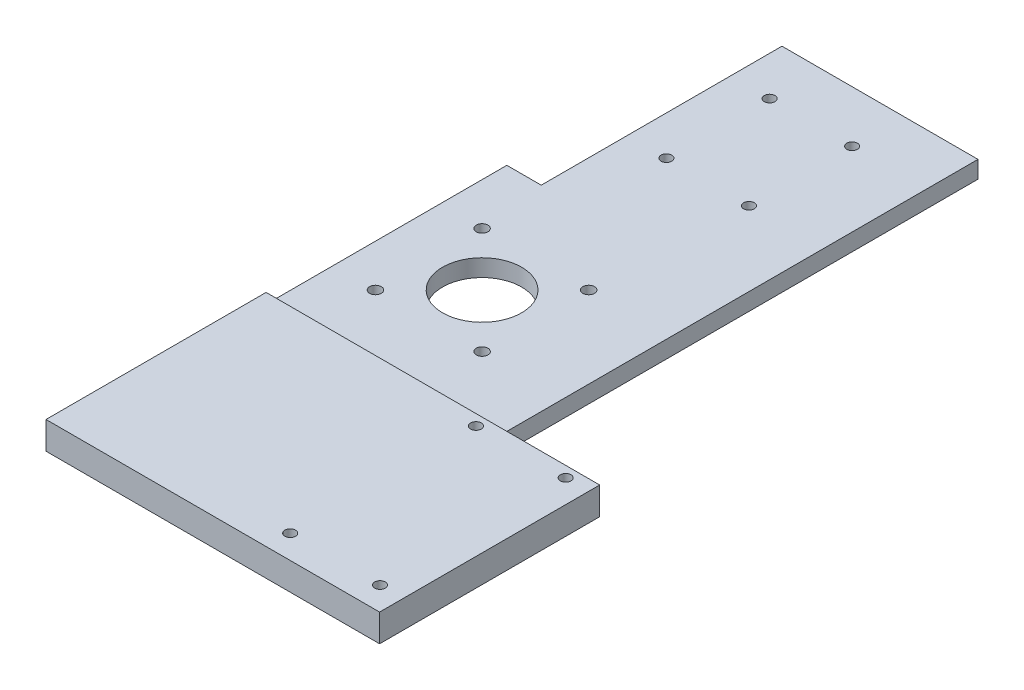
ISO-10303-21;
HEADER;
FILE_DESCRIPTION(('STEP AP214'),'2;1');
FILE_NAME('part.step','',(''),(''),'','','');
FILE_SCHEMA(('AUTOMOTIVE_DESIGN { 1 0 10303 214 1 1 1 1 }'));
ENDSEC;
DATA;
#1=APPLICATION_CONTEXT('core data for automotive mechanical design processes');
#2=APPLICATION_PROTOCOL_DEFINITION('international standard','automotive_design',2000,#1);
#3=PRODUCT_CONTEXT('',#1,'mechanical');
#4=PRODUCT('Part','Part','',(#3));
#5=PRODUCT_RELATED_PRODUCT_CATEGORY('part','',(#4));
#6=PRODUCT_DEFINITION_FORMATION('','',#4);
#7=PRODUCT_DEFINITION_CONTEXT('part definition',#1,'design');
#8=PRODUCT_DEFINITION('design','',#6,#7);
#9=PRODUCT_DEFINITION_SHAPE('','',#8);
#10=(LENGTH_UNIT() NAMED_UNIT(*) SI_UNIT(.MILLI.,.METRE.));
#11=(NAMED_UNIT(*) PLANE_ANGLE_UNIT() SI_UNIT($,.RADIAN.));
#12=(NAMED_UNIT(*) SI_UNIT($,.STERADIAN.) SOLID_ANGLE_UNIT());
#13=UNCERTAINTY_MEASURE_WITH_UNIT(LENGTH_MEASURE(1.E-05),#10,'distance_accuracy_value','');
#14=(GEOMETRIC_REPRESENTATION_CONTEXT(3) GLOBAL_UNCERTAINTY_ASSIGNED_CONTEXT((#13)) GLOBAL_UNIT_ASSIGNED_CONTEXT((#10,
#11,#12)) REPRESENTATION_CONTEXT('',''));
#15=CARTESIAN_POINT('',(0.,0.,0.));
#16=DIRECTION('',(0.,0.,1.));
#17=DIRECTION('',(1.,0.,0.));
#18=AXIS2_PLACEMENT_3D('',#15,#16,#17);
#19=CARTESIAN_POINT('',(0.,5.,0.));
#20=DIRECTION('',(1.,0.,0.));
#21=DIRECTION('',(0.,0.,-1.));
#22=AXIS2_PLACEMENT_3D('',#19,#20,#21);
#23=PLANE('',#22);
#24=DIRECTION('',(0.,-1.,0.));
#25=VECTOR('',#24,1.);
#26=CARTESIAN_POINT('',(0.,5.,70.));
#27=LINE('',#26,#25);
#28=CARTESIAN_POINT('',(0.,5.,70.));
#29=VERTEX_POINT('',#28);
#30=CARTESIAN_POINT('',(0.,0.,70.));
#31=VERTEX_POINT('',#30);
#32=EDGE_CURVE('E53',#29,#31,#27,.T.);
#33=ORIENTED_EDGE('',*,*,#32,.F.);
#34=DIRECTION('',(0.,0.,1.));
#35=VECTOR('',#34,1.);
#36=CARTESIAN_POINT('',(0.,5.,0.));
#37=LINE('',#36,#35);
#38=CARTESIAN_POINT('',(0.,5.,0.));
#39=VERTEX_POINT('',#38);
#40=EDGE_CURVE('E216',#39,#29,#37,.T.);
#41=ORIENTED_EDGE('',*,*,#40,.F.);
#42=DIRECTION('',(0.,-1.,0.));
#43=VECTOR('',#42,1.);
#44=CARTESIAN_POINT('',(0.,5.,0.));
#45=LINE('',#44,#43);
#46=CARTESIAN_POINT('',(0.,0.,0.));
#47=VERTEX_POINT('',#46);
#48=EDGE_CURVE('E223',#39,#47,#45,.T.);
#49=ORIENTED_EDGE('',*,*,#48,.T.);
#50=DIRECTION('',(0.,0.,1.));
#51=VECTOR('',#50,1.);
#52=CARTESIAN_POINT('',(0.,0.,0.));
#53=LINE('',#52,#51);
#54=EDGE_CURVE('E215',#47,#31,#53,.T.);
#55=ORIENTED_EDGE('',*,*,#54,.T.);
#56=EDGE_LOOP('',(#33,#41,#49,#55));
#57=FACE_BOUND('',#56,.T.);
#58=ADVANCED_FACE('F37',(#57),#23,.F.);
#59=CARTESIAN_POINT('',(57.,5.,0.));
#60=DIRECTION('',(-1.,0.,0.));
#61=DIRECTION('',(0.,0.,1.));
#62=AXIS2_PLACEMENT_3D('',#59,#60,#61);
#63=PLANE('',#62);
#64=DIRECTION('',(0.,0.,-1.));
#65=VECTOR('',#64,1.);
#66=CARTESIAN_POINT('',(57.,0.,0.));
#67=LINE('',#66,#65);
#68=CARTESIAN_POINT('',(57.,0.,140.));
#69=VERTEX_POINT('',#68);
#70=CARTESIAN_POINT('',(57.,0.,0.));
#71=VERTEX_POINT('',#70);
#72=EDGE_CURVE('E125',#69,#71,#67,.T.);
#73=ORIENTED_EDGE('',*,*,#72,.T.);
#74=DIRECTION('',(0.,-1.,0.));
#75=VECTOR('',#74,1.);
#76=CARTESIAN_POINT('',(57.,5.,0.));
#77=LINE('',#76,#75);
#78=CARTESIAN_POINT('',(57.,5.,0.));
#79=VERTEX_POINT('',#78);
#80=EDGE_CURVE('E45',#79,#71,#77,.T.);
#81=ORIENTED_EDGE('',*,*,#80,.F.);
#82=DIRECTION('',(0.,0.,-1.));
#83=VECTOR('',#82,1.);
#84=CARTESIAN_POINT('',(57.,5.,0.));
#85=LINE('',#84,#83);
#86=CARTESIAN_POINT('',(57.,5.,140.));
#87=VERTEX_POINT('',#86);
#88=EDGE_CURVE('E220',#87,#79,#85,.T.);
#89=ORIENTED_EDGE('',*,*,#88,.F.);
#90=DIRECTION('',(0.,-1.,0.));
#91=VECTOR('',#90,1.);
#92=CARTESIAN_POINT('',(57.,5.,140.));
#93=LINE('',#92,#91);
#94=EDGE_CURVE('E11',#87,#69,#93,.T.);
#95=ORIENTED_EDGE('',*,*,#94,.T.);
#96=EDGE_LOOP('',(#73,#81,#89,#95));
#97=FACE_BOUND('',#96,.T.);
#98=ADVANCED_FACE('F259',(#97),#63,.F.);
#99=CARTESIAN_POINT('',(0.,5.,0.));
#100=DIRECTION('',(0.,0.,1.));
#101=DIRECTION('',(1.,0.,0.));
#102=AXIS2_PLACEMENT_3D('',#99,#100,#101);
#103=PLANE('',#102);
#104=DIRECTION('',(-1.,0.,0.));
#105=VECTOR('',#104,1.);
#106=CARTESIAN_POINT('',(0.,0.,0.));
#107=LINE('',#106,#105);
#108=EDGE_CURVE('E75',#71,#47,#107,.T.);
#109=ORIENTED_EDGE('',*,*,#108,.T.);
#110=ORIENTED_EDGE('',*,*,#48,.F.);
#111=DIRECTION('',(-1.,0.,0.));
#112=VECTOR('',#111,1.);
#113=CARTESIAN_POINT('',(0.,5.,0.));
#114=LINE('',#113,#112);
#115=EDGE_CURVE('E61',#79,#39,#114,.T.);
#116=ORIENTED_EDGE('',*,*,#115,.F.);
#117=ORIENTED_EDGE('',*,*,#80,.T.);
#118=EDGE_LOOP('',(#109,#110,#116,#117));
#119=FACE_BOUND('',#118,.T.);
#120=ADVANCED_FACE('F263',(#119),#103,.F.);
#121=CARTESIAN_POINT('',(0.,5.,0.));
#122=DIRECTION('',(0.,1.,0.));
#123=DIRECTION('',(0.,0.,1.));
#124=AXIS2_PLACEMENT_3D('',#121,#122,#123);
#125=PLANE('',#124);
#126=CARTESIAN_POINT('',(33.3,5.,120.5));
#127=DIRECTION('',(0.,1.,0.));
#128=DIRECTION('',(0.,0.,1.));
#129=AXIS2_PLACEMENT_3D('',#126,#127,#128);
#130=CIRCLE('',#129,1.7);
#131=CARTESIAN_POINT('',(33.3,5.,122.2));
#132=VERTEX_POINT('',#131);
#133=EDGE_CURVE('E136',#132,#132,#130,.T.);
#134=ORIENTED_EDGE('',*,*,#133,.F.);
#135=EDGE_LOOP('',(#134));
#136=FACE_BOUND('',#135,.T.);
#137=CARTESIAN_POINT('',(2.30000000000002,5.,120.5));
#138=DIRECTION('',(0.,1.,0.));
#139=DIRECTION('',(0.,0.,1.));
#140=AXIS2_PLACEMENT_3D('',#137,#138,#139);
#141=CIRCLE('',#140,1.7);
#142=CARTESIAN_POINT('',(2.30000000000002,5.,122.2));
#143=VERTEX_POINT('',#142);
#144=EDGE_CURVE('E170',#143,#143,#141,.T.);
#145=ORIENTED_EDGE('',*,*,#144,.F.);
#146=EDGE_LOOP('',(#145));
#147=FACE_BOUND('',#146,.T.);
#148=CARTESIAN_POINT('',(2.30000000000002,5.,89.5));
#149=DIRECTION('',(0.,1.,0.));
#150=DIRECTION('',(0.,0.,1.));
#151=AXIS2_PLACEMENT_3D('',#148,#149,#150);
#152=CIRCLE('',#151,1.7);
#153=CARTESIAN_POINT('',(2.30000000000002,5.,91.2));
#154=VERTEX_POINT('',#153);
#155=EDGE_CURVE('E167',#154,#154,#152,.T.);
#156=ORIENTED_EDGE('',*,*,#155,.F.);
#157=EDGE_LOOP('',(#156));
#158=FACE_BOUND('',#157,.T.);
#159=CARTESIAN_POINT('',(33.3,5.,89.5));
#160=DIRECTION('',(0.,1.,0.));
#161=DIRECTION('',(0.,0.,1.));
#162=AXIS2_PLACEMENT_3D('',#159,#160,#161);
#163=CIRCLE('',#162,1.7);
#164=CARTESIAN_POINT('',(33.3,5.,91.2));
#165=VERTEX_POINT('',#164);
#166=EDGE_CURVE('E163',#165,#165,#163,.T.);
#167=ORIENTED_EDGE('',*,*,#166,.F.);
#168=EDGE_LOOP('',(#167));
#169=FACE_BOUND('',#168,.T.);
#170=CARTESIAN_POINT('',(17.8,5.,105.));
#171=DIRECTION('',(0.,1.,0.));
#172=DIRECTION('',(0.,0.,1.));
#173=AXIS2_PLACEMENT_3D('',#170,#171,#172);
#174=CIRCLE('',#173,11.5);
#175=CARTESIAN_POINT('',(17.8,5.,116.5));
#176=VERTEX_POINT('',#175);
#177=EDGE_CURVE('E166',#176,#176,#174,.T.);
#178=ORIENTED_EDGE('',*,*,#177,.F.);
#179=EDGE_LOOP('',(#178));
#180=FACE_BOUND('',#179,.T.);
#181=CARTESIAN_POINT('',(35.3999999999997,5.,45.0000000000148));
#182=DIRECTION('',(0.,1.,0.));
#183=DIRECTION('',(0.,0.,1.));
#184=AXIS2_PLACEMENT_3D('',#181,#182,#183);
#185=CIRCLE('',#184,1.55000000000001);
#186=CARTESIAN_POINT('',(35.3999999999997,5.,46.5500000000148));
#187=VERTEX_POINT('',#186);
#188=EDGE_CURVE('E212',#187,#187,#185,.T.);
#189=ORIENTED_EDGE('',*,*,#188,.F.);
#190=EDGE_LOOP('',(#189));
#191=FACE_BOUND('',#190,.T.);
#192=CARTESIAN_POINT('',(35.3999999999997,5.,15.0000000000148));
#193=DIRECTION('',(0.,1.,0.));
#194=DIRECTION('',(0.,0.,1.));
#195=AXIS2_PLACEMENT_3D('',#192,#193,#194);
#196=CIRCLE('',#195,1.54999999999999);
#197=CARTESIAN_POINT('',(35.3999999999997,5.,16.5500000000148));
#198=VERTEX_POINT('',#197);
#199=EDGE_CURVE('E209',#198,#198,#196,.T.);
#200=ORIENTED_EDGE('',*,*,#199,.F.);
#201=EDGE_LOOP('',(#200));
#202=FACE_BOUND('',#201,.T.);
#203=CARTESIAN_POINT('',(11.3999999999997,5.,15.0000000000148));
#204=DIRECTION('',(0.,1.,0.));
#205=DIRECTION('',(0.,0.,1.));
#206=AXIS2_PLACEMENT_3D('',#203,#204,#205);
#207=CIRCLE('',#206,1.55000000000001);
#208=CARTESIAN_POINT('',(11.3999999999997,5.,16.5500000000148));
#209=VERTEX_POINT('',#208);
#210=EDGE_CURVE('E206',#209,#209,#207,.T.);
#211=ORIENTED_EDGE('',*,*,#210,.F.);
#212=EDGE_LOOP('',(#211));
#213=FACE_BOUND('',#212,.T.);
#214=CARTESIAN_POINT('',(11.3999999999997,5.,45.0000000000148));
#215=DIRECTION('',(0.,1.,0.));
#216=DIRECTION('',(0.,0.,1.));
#217=AXIS2_PLACEMENT_3D('',#214,#215,#216);
#218=CIRCLE('',#217,1.55000000000002);
#219=CARTESIAN_POINT('',(11.3999999999997,5.,46.5500000000148));
#220=VERTEX_POINT('',#219);
#221=EDGE_CURVE('E203',#220,#220,#218,.T.);
#222=ORIENTED_EDGE('',*,*,#221,.F.);
#223=EDGE_LOOP('',(#222));
#224=FACE_BOUND('',#223,.T.);
#225=ORIENTED_EDGE('',*,*,#40,.T.);
#226=DIRECTION('',(1.,0.,0.));
#227=VECTOR('',#226,1.);
#228=CARTESIAN_POINT('',(-9.99999999999999,5.,70.));
#229=LINE('',#228,#227);
#230=CARTESIAN_POINT('',(-9.99999999999999,5.,70.));
#231=VERTEX_POINT('',#230);
#232=EDGE_CURVE('E188',#231,#29,#229,.T.);
#233=ORIENTED_EDGE('',*,*,#232,.F.);
#234=DIRECTION('',(0.,0.,-1.));
#235=VECTOR('',#234,1.);
#236=CARTESIAN_POINT('',(-9.99999999999998,5.,140.));
#237=LINE('',#236,#235);
#238=CARTESIAN_POINT('',(-9.99999999999998,5.,140.));
#239=VERTEX_POINT('',#238);
#240=EDGE_CURVE('E178',#239,#231,#237,.T.);
#241=ORIENTED_EDGE('',*,*,#240,.F.);
#242=DIRECTION('',(1.,0.,0.));
#243=VECTOR('',#242,1.);
#244=CARTESIAN_POINT('',(0.,5.,140.));
#245=LINE('',#244,#243);
#246=EDGE_CURVE('E218',#239,#87,#245,.T.);
#247=ORIENTED_EDGE('',*,*,#246,.T.);
#248=ORIENTED_EDGE('',*,*,#88,.T.);
#249=ORIENTED_EDGE('',*,*,#115,.T.);
#250=EDGE_LOOP('',(#225,#233,#241,#247,#248,#249));
#251=FACE_BOUND('',#250,.T.);
#252=ADVANCED_FACE('F268',(#136,#147,#158,#169,#180,#191,#202,#213,#224,#251),#125,.T.);
#253=CARTESIAN_POINT('',(0.,0.,0.));
#254=DIRECTION('',(0.,1.,0.));
#255=DIRECTION('',(0.,0.,1.));
#256=AXIS2_PLACEMENT_3D('',#253,#254,#255);
#257=PLANE('',#256);
#258=CARTESIAN_POINT('',(80.2500000000012,0.,197.137921191533));
#259=DIRECTION('',(0.,1.,0.));
#260=DIRECTION('',(0.,0.,1.));
#261=AXIS2_PLACEMENT_3D('',#258,#259,#260);
#262=CIRCLE('',#261,1.54999999999999);
#263=CARTESIAN_POINT('',(80.2500000000012,0.,198.687921191533));
#264=VERTEX_POINT('',#263);
#265=EDGE_CURVE('E142',#264,#264,#262,.T.);
#266=ORIENTED_EDGE('',*,*,#265,.T.);
#267=EDGE_LOOP('',(#266));
#268=FACE_BOUND('',#267,.T.);
#269=CARTESIAN_POINT('',(54.1500000000012,0.,143.137921191533));
#270=DIRECTION('',(0.,1.,0.));
#271=DIRECTION('',(0.,0.,1.));
#272=AXIS2_PLACEMENT_3D('',#269,#270,#271);
#273=CIRCLE('',#272,1.55);
#274=CARTESIAN_POINT('',(54.1500000000012,0.,144.687921191533));
#275=VERTEX_POINT('',#274);
#276=EDGE_CURVE('E145',#275,#275,#273,.T.);
#277=ORIENTED_EDGE('',*,*,#276,.T.);
#278=EDGE_LOOP('',(#277));
#279=FACE_BOUND('',#278,.T.);
#280=CARTESIAN_POINT('',(80.2500000000012,0.,143.137921191533));
#281=DIRECTION('',(0.,1.,0.));
#282=DIRECTION('',(0.,0.,1.));
#283=AXIS2_PLACEMENT_3D('',#280,#281,#282);
#284=CIRCLE('',#283,1.54999999999999);
#285=CARTESIAN_POINT('',(80.2500000000012,0.,144.687921191533));
#286=VERTEX_POINT('',#285);
#287=EDGE_CURVE('E490',#286,#286,#284,.T.);
#288=ORIENTED_EDGE('',*,*,#287,.T.);
#289=EDGE_LOOP('',(#288));
#290=FACE_BOUND('',#289,.T.);
#291=CARTESIAN_POINT('',(54.1500000000012,0.,197.137921191533));
#292=DIRECTION('',(0.,1.,0.));
#293=DIRECTION('',(0.,0.,1.));
#294=AXIS2_PLACEMENT_3D('',#291,#292,#293);
#295=CIRCLE('',#294,1.55);
#296=CARTESIAN_POINT('',(54.1500000000012,0.,198.687921191533));
#297=VERTEX_POINT('',#296);
#298=EDGE_CURVE('E493',#297,#297,#295,.T.);
#299=ORIENTED_EDGE('',*,*,#298,.T.);
#300=EDGE_LOOP('',(#299));
#301=FACE_BOUND('',#300,.T.);
#302=CARTESIAN_POINT('',(33.3,0.,120.5));
#303=DIRECTION('',(0.,1.,0.));
#304=DIRECTION('',(0.,0.,1.));
#305=AXIS2_PLACEMENT_3D('',#302,#303,#304);
#306=CIRCLE('',#305,1.7);
#307=CARTESIAN_POINT('',(33.3,0.,122.2));
#308=VERTEX_POINT('',#307);
#309=EDGE_CURVE('E40',#308,#308,#306,.T.);
#310=ORIENTED_EDGE('',*,*,#309,.T.);
#311=EDGE_LOOP('',(#310));
#312=FACE_BOUND('',#311,.T.);
#313=CARTESIAN_POINT('',(2.30000000000002,0.,120.5));
#314=DIRECTION('',(0.,1.,0.));
#315=DIRECTION('',(0.,0.,1.));
#316=AXIS2_PLACEMENT_3D('',#313,#314,#315);
#317=CIRCLE('',#316,1.7);
#318=CARTESIAN_POINT('',(2.30000000000002,0.,122.2));
#319=VERTEX_POINT('',#318);
#320=EDGE_CURVE('E236',#319,#319,#317,.T.);
#321=ORIENTED_EDGE('',*,*,#320,.T.);
#322=EDGE_LOOP('',(#321));
#323=FACE_BOUND('',#322,.T.);
#324=CARTESIAN_POINT('',(2.30000000000002,0.,89.5));
#325=DIRECTION('',(0.,1.,0.));
#326=DIRECTION('',(0.,0.,1.));
#327=AXIS2_PLACEMENT_3D('',#324,#325,#326);
#328=CIRCLE('',#327,1.7);
#329=CARTESIAN_POINT('',(2.30000000000002,0.,91.2));
#330=VERTEX_POINT('',#329);
#331=EDGE_CURVE('E234',#330,#330,#328,.T.);
#332=ORIENTED_EDGE('',*,*,#331,.T.);
#333=EDGE_LOOP('',(#332));
#334=FACE_BOUND('',#333,.T.);
#335=CARTESIAN_POINT('',(33.3,0.,89.5));
#336=DIRECTION('',(0.,1.,0.));
#337=DIRECTION('',(0.,0.,1.));
#338=AXIS2_PLACEMENT_3D('',#335,#336,#337);
#339=CIRCLE('',#338,1.7);
#340=CARTESIAN_POINT('',(33.3,0.,91.2));
#341=VERTEX_POINT('',#340);
#342=EDGE_CURVE('E231',#341,#341,#339,.T.);
#343=ORIENTED_EDGE('',*,*,#342,.T.);
#344=EDGE_LOOP('',(#343));
#345=FACE_BOUND('',#344,.T.);
#346=CARTESIAN_POINT('',(17.8,0.,105.));
#347=DIRECTION('',(0.,1.,0.));
#348=DIRECTION('',(0.,0.,1.));
#349=AXIS2_PLACEMENT_3D('',#346,#347,#348);
#350=CIRCLE('',#349,11.5);
#351=CARTESIAN_POINT('',(17.8,0.,116.5));
#352=VERTEX_POINT('',#351);
#353=EDGE_CURVE('E177',#352,#352,#350,.T.);
#354=ORIENTED_EDGE('',*,*,#353,.T.);
#355=EDGE_LOOP('',(#354));
#356=FACE_BOUND('',#355,.T.);
#357=CARTESIAN_POINT('',(35.3999999999997,0.,45.0000000000148));
#358=DIRECTION('',(0.,-1.,0.));
#359=DIRECTION('',(0.,0.,-1.));
#360=AXIS2_PLACEMENT_3D('',#357,#358,#359);
#361=CIRCLE('',#360,1.55000000000001);
#362=CARTESIAN_POINT('',(35.3999999999997,0.,43.4500000000148));
#363=VERTEX_POINT('',#362);
#364=EDGE_CURVE('E191',#363,#363,#361,.T.);
#365=ORIENTED_EDGE('',*,*,#364,.F.);
#366=EDGE_LOOP('',(#365));
#367=FACE_BOUND('',#366,.T.);
#368=CARTESIAN_POINT('',(35.3999999999997,0.,15.0000000000148));
#369=DIRECTION('',(0.,-1.,0.));
#370=DIRECTION('',(0.,0.,-1.));
#371=AXIS2_PLACEMENT_3D('',#368,#369,#370);
#372=CIRCLE('',#371,1.54999999999999);
#373=CARTESIAN_POINT('',(35.3999999999997,0.,13.4500000000148));
#374=VERTEX_POINT('',#373);
#375=EDGE_CURVE('E196',#374,#374,#372,.T.);
#376=ORIENTED_EDGE('',*,*,#375,.F.);
#377=EDGE_LOOP('',(#376));
#378=FACE_BOUND('',#377,.T.);
#379=CARTESIAN_POINT('',(11.3999999999997,0.,15.0000000000148));
#380=DIRECTION('',(0.,-1.,0.));
#381=DIRECTION('',(0.,0.,-1.));
#382=AXIS2_PLACEMENT_3D('',#379,#380,#381);
#383=CIRCLE('',#382,1.55000000000001);
#384=CARTESIAN_POINT('',(11.3999999999997,0.,13.4500000000148));
#385=VERTEX_POINT('',#384);
#386=EDGE_CURVE('E192',#385,#385,#383,.T.);
#387=ORIENTED_EDGE('',*,*,#386,.F.);
#388=EDGE_LOOP('',(#387));
#389=FACE_BOUND('',#388,.T.);
#390=CARTESIAN_POINT('',(11.3999999999997,0.,45.0000000000148));
#391=DIRECTION('',(0.,-1.,0.));
#392=DIRECTION('',(0.,0.,-1.));
#393=AXIS2_PLACEMENT_3D('',#390,#391,#392);
#394=CIRCLE('',#393,1.55000000000002);
#395=CARTESIAN_POINT('',(11.3999999999997,0.,43.4500000000148));
#396=VERTEX_POINT('',#395);
#397=EDGE_CURVE('E195',#396,#396,#394,.T.);
#398=ORIENTED_EDGE('',*,*,#397,.F.);
#399=EDGE_LOOP('',(#398));
#400=FACE_BOUND('',#399,.T.);
#401=ORIENTED_EDGE('',*,*,#54,.F.);
#402=ORIENTED_EDGE('',*,*,#108,.F.);
#403=ORIENTED_EDGE('',*,*,#72,.F.);
#404=DIRECTION('',(1.,0.,0.));
#405=VECTOR('',#404,1.);
#406=CARTESIAN_POINT('',(0.,0.,140.));
#407=LINE('',#406,#405);
#408=CARTESIAN_POINT('',(87.,0.,140.));
#409=VERTEX_POINT('',#408);
#410=EDGE_CURVE('E117',#69,#409,#407,.T.);
#411=ORIENTED_EDGE('',*,*,#410,.T.);
#412=DIRECTION('',(0.,0.,1.));
#413=VECTOR('',#412,1.);
#414=CARTESIAN_POINT('',(87.,0.,0.));
#415=LINE('',#414,#413);
#416=CARTESIAN_POINT('',(87.,0.,204.));
#417=VERTEX_POINT('',#416);
#418=EDGE_CURVE('E123',#409,#417,#415,.T.);
#419=ORIENTED_EDGE('',*,*,#418,.T.);
#420=DIRECTION('',(1.,0.,0.));
#421=VECTOR('',#420,1.);
#422=CARTESIAN_POINT('',(0.,0.,204.));
#423=LINE('',#422,#421);
#424=CARTESIAN_POINT('',(-9.99999999999997,0.,204.));
#425=VERTEX_POINT('',#424);
#426=EDGE_CURVE('E126',#425,#417,#423,.T.);
#427=ORIENTED_EDGE('',*,*,#426,.F.);
#428=DIRECTION('',(0.,0.,1.));
#429=VECTOR('',#428,1.);
#430=CARTESIAN_POINT('',(-9.99999999999999,0.,70.));
#431=LINE('',#430,#429);
#432=CARTESIAN_POINT('',(-9.99999999999999,0.,70.));
#433=VERTEX_POINT('',#432);
#434=EDGE_CURVE('E182',#433,#425,#431,.T.);
#435=ORIENTED_EDGE('',*,*,#434,.F.);
#436=DIRECTION('',(1.,0.,0.));
#437=VECTOR('',#436,1.);
#438=CARTESIAN_POINT('',(-9.99999999999999,0.,70.));
#439=LINE('',#438,#437);
#440=EDGE_CURVE('E184',#433,#31,#439,.T.);
#441=ORIENTED_EDGE('',*,*,#440,.T.);
#442=EDGE_LOOP('',(#401,#402,#403,#411,#419,#427,#435,#441));
#443=FACE_BOUND('',#442,.T.);
#444=ADVANCED_FACE('F120',(#268,#279,#290,#301,#312,#323,#334,#345,#356,#367,#378,#389,#400,
#443),#257,.F.);
#445=CARTESIAN_POINT('',(11.3999999999997,10.,45.0000000000148));
#446=DIRECTION('',(0.,-1.,0.));
#447=DIRECTION('',(0.,0.,-1.));
#448=AXIS2_PLACEMENT_3D('',#445,#446,#447);
#449=CYLINDRICAL_SURFACE('',#448,1.55000000000002);
#450=ORIENTED_EDGE('',*,*,#221,.T.);
#451=EDGE_LOOP('',(#450));
#452=FACE_BOUND('',#451,.T.);
#453=ORIENTED_EDGE('',*,*,#397,.T.);
#454=EDGE_LOOP('',(#453));
#455=FACE_BOUND('',#454,.T.);
#456=ADVANCED_FACE('F273',(#452,#455),#449,.F.);
#457=CARTESIAN_POINT('',(11.3999999999997,10.,15.0000000000148));
#458=DIRECTION('',(0.,-1.,0.));
#459=DIRECTION('',(0.,0.,-1.));
#460=AXIS2_PLACEMENT_3D('',#457,#458,#459);
#461=CYLINDRICAL_SURFACE('',#460,1.55000000000001);
#462=ORIENTED_EDGE('',*,*,#210,.T.);
#463=EDGE_LOOP('',(#462));
#464=FACE_BOUND('',#463,.T.);
#465=ORIENTED_EDGE('',*,*,#386,.T.);
#466=EDGE_LOOP('',(#465));
#467=FACE_BOUND('',#466,.T.);
#468=ADVANCED_FACE('F280',(#464,#467),#461,.F.);
#469=CARTESIAN_POINT('',(35.3999999999997,10.,15.0000000000148));
#470=DIRECTION('',(0.,-1.,0.));
#471=DIRECTION('',(0.,0.,-1.));
#472=AXIS2_PLACEMENT_3D('',#469,#470,#471);
#473=CYLINDRICAL_SURFACE('',#472,1.54999999999999);
#474=ORIENTED_EDGE('',*,*,#199,.T.);
#475=EDGE_LOOP('',(#474));
#476=FACE_BOUND('',#475,.T.);
#477=ORIENTED_EDGE('',*,*,#375,.T.);
#478=EDGE_LOOP('',(#477));
#479=FACE_BOUND('',#478,.T.);
#480=ADVANCED_FACE('F286',(#476,#479),#473,.F.);
#481=CARTESIAN_POINT('',(35.3999999999997,10.,45.0000000000148));
#482=DIRECTION('',(0.,-1.,0.));
#483=DIRECTION('',(0.,0.,-1.));
#484=AXIS2_PLACEMENT_3D('',#481,#482,#483);
#485=CYLINDRICAL_SURFACE('',#484,1.55000000000001);
#486=ORIENTED_EDGE('',*,*,#188,.T.);
#487=EDGE_LOOP('',(#486));
#488=FACE_BOUND('',#487,.T.);
#489=ORIENTED_EDGE('',*,*,#364,.T.);
#490=EDGE_LOOP('',(#489));
#491=FACE_BOUND('',#490,.T.);
#492=ADVANCED_FACE('F282',(#488,#491),#485,.F.);
#493=CARTESIAN_POINT('',(-9.99999999999999,5.,70.));
#494=DIRECTION('',(0.,0.,1.));
#495=DIRECTION('',(1.,0.,0.));
#496=AXIS2_PLACEMENT_3D('',#493,#494,#495);
#497=PLANE('',#496);
#498=ORIENTED_EDGE('',*,*,#32,.T.);
#499=ORIENTED_EDGE('',*,*,#440,.F.);
#500=DIRECTION('',(0.,-1.,0.));
#501=VECTOR('',#500,1.);
#502=CARTESIAN_POINT('',(-9.99999999999999,5.,70.));
#503=LINE('',#502,#501);
#504=EDGE_CURVE('E180',#231,#433,#503,.T.);
#505=ORIENTED_EDGE('',*,*,#504,.F.);
#506=ORIENTED_EDGE('',*,*,#232,.T.);
#507=EDGE_LOOP('',(#498,#499,#505,#506));
#508=FACE_BOUND('',#507,.T.);
#509=ADVANCED_FACE('F285',(#508),#497,.F.);
#510=CARTESIAN_POINT('',(-10.,0.,0.));
#511=DIRECTION('',(-1.,0.,0.));
#512=DIRECTION('',(0.,0.,1.));
#513=AXIS2_PLACEMENT_3D('',#510,#511,#512);
#514=PLANE('',#513);
#515=ORIENTED_EDGE('',*,*,#434,.T.);
#516=DIRECTION('',(0.,-1.,0.));
#517=VECTOR('',#516,1.);
#518=CARTESIAN_POINT('',(-9.99999999999997,8.,204.));
#519=LINE('',#518,#517);
#520=CARTESIAN_POINT('',(-9.99999999999997,8.,204.));
#521=VERTEX_POINT('',#520);
#522=EDGE_CURVE('E158',#521,#425,#519,.T.);
#523=ORIENTED_EDGE('',*,*,#522,.F.);
#524=DIRECTION('',(0.,0.,1.));
#525=VECTOR('',#524,1.);
#526=CARTESIAN_POINT('',(-10.,8.,0.));
#527=LINE('',#526,#525);
#528=CARTESIAN_POINT('',(-9.99999999999998,8.,140.));
#529=VERTEX_POINT('',#528);
#530=EDGE_CURVE('E153',#529,#521,#527,.T.);
#531=ORIENTED_EDGE('',*,*,#530,.F.);
#532=DIRECTION('',(0.,-1.,0.));
#533=VECTOR('',#532,1.);
#534=CARTESIAN_POINT('',(-9.99999999999998,8.,140.));
#535=LINE('',#534,#533);
#536=EDGE_CURVE('E137',#529,#239,#535,.T.);
#537=ORIENTED_EDGE('',*,*,#536,.T.);
#538=ORIENTED_EDGE('',*,*,#240,.T.);
#539=ORIENTED_EDGE('',*,*,#504,.T.);
#540=EDGE_LOOP('',(#515,#523,#531,#537,#538,#539));
#541=FACE_BOUND('',#540,.T.);
#542=ADVANCED_FACE('F296',(#541),#514,.T.);
#543=CARTESIAN_POINT('',(17.8,-5.,105.));
#544=DIRECTION('',(0.,1.,0.));
#545=DIRECTION('',(0.,0.,1.));
#546=AXIS2_PLACEMENT_3D('',#543,#544,#545);
#547=CYLINDRICAL_SURFACE('',#546,11.5);
#548=ORIENTED_EDGE('',*,*,#177,.T.);
#549=EDGE_LOOP('',(#548));
#550=FACE_BOUND('',#549,.T.);
#551=ORIENTED_EDGE('',*,*,#353,.F.);
#552=EDGE_LOOP('',(#551));
#553=FACE_BOUND('',#552,.T.);
#554=ADVANCED_FACE('F299',(#550,#553),#547,.F.);
#555=CARTESIAN_POINT('',(33.3,-5.,89.5));
#556=DIRECTION('',(0.,1.,0.));
#557=DIRECTION('',(0.,0.,1.));
#558=AXIS2_PLACEMENT_3D('',#555,#556,#557);
#559=CYLINDRICAL_SURFACE('',#558,1.7);
#560=ORIENTED_EDGE('',*,*,#166,.T.);
#561=EDGE_LOOP('',(#560));
#562=FACE_BOUND('',#561,.T.);
#563=ORIENTED_EDGE('',*,*,#342,.F.);
#564=EDGE_LOOP('',(#563));
#565=FACE_BOUND('',#564,.T.);
#566=ADVANCED_FACE('F302',(#562,#565),#559,.F.);
#567=CARTESIAN_POINT('',(2.30000000000002,-5.,89.5));
#568=DIRECTION('',(0.,1.,0.));
#569=DIRECTION('',(0.,0.,1.));
#570=AXIS2_PLACEMENT_3D('',#567,#568,#569);
#571=CYLINDRICAL_SURFACE('',#570,1.7);
#572=ORIENTED_EDGE('',*,*,#155,.T.);
#573=EDGE_LOOP('',(#572));
#574=FACE_BOUND('',#573,.T.);
#575=ORIENTED_EDGE('',*,*,#331,.F.);
#576=EDGE_LOOP('',(#575));
#577=FACE_BOUND('',#576,.T.);
#578=ADVANCED_FACE('F254',(#574,#577),#571,.F.);
#579=CARTESIAN_POINT('',(2.30000000000002,-5.,120.5));
#580=DIRECTION('',(0.,1.,0.));
#581=DIRECTION('',(0.,0.,1.));
#582=AXIS2_PLACEMENT_3D('',#579,#580,#581);
#583=CYLINDRICAL_SURFACE('',#582,1.7);
#584=ORIENTED_EDGE('',*,*,#144,.T.);
#585=EDGE_LOOP('',(#584));
#586=FACE_BOUND('',#585,.T.);
#587=ORIENTED_EDGE('',*,*,#320,.F.);
#588=EDGE_LOOP('',(#587));
#589=FACE_BOUND('',#588,.T.);
#590=ADVANCED_FACE('F246',(#586,#589),#583,.F.);
#591=CARTESIAN_POINT('',(33.3,-5.,120.5));
#592=DIRECTION('',(0.,1.,0.));
#593=DIRECTION('',(0.,0.,1.));
#594=AXIS2_PLACEMENT_3D('',#591,#592,#593);
#595=CYLINDRICAL_SURFACE('',#594,1.7);
#596=ORIENTED_EDGE('',*,*,#133,.T.);
#597=EDGE_LOOP('',(#596));
#598=FACE_BOUND('',#597,.T.);
#599=ORIENTED_EDGE('',*,*,#309,.F.);
#600=EDGE_LOOP('',(#599));
#601=FACE_BOUND('',#600,.T.);
#602=ADVANCED_FACE('F244',(#598,#601),#595,.F.);
#603=CARTESIAN_POINT('',(0.,8.,140.));
#604=DIRECTION('',(0.,0.,-1.));
#605=DIRECTION('',(-1.,0.,0.));
#606=AXIS2_PLACEMENT_3D('',#603,#604,#605);
#607=PLANE('',#606);
#608=ORIENTED_EDGE('',*,*,#94,.F.);
#609=ORIENTED_EDGE('',*,*,#246,.F.);
#610=ORIENTED_EDGE('',*,*,#536,.F.);
#611=DIRECTION('',(1.,0.,0.));
#612=VECTOR('',#611,1.);
#613=CARTESIAN_POINT('',(0.,8.,140.));
#614=LINE('',#613,#612);
#615=CARTESIAN_POINT('',(87.,8.,140.));
#616=VERTEX_POINT('',#615);
#617=EDGE_CURVE('E132',#529,#616,#614,.T.);
#618=ORIENTED_EDGE('',*,*,#617,.T.);
#619=DIRECTION('',(0.,-1.,0.));
#620=VECTOR('',#619,1.);
#621=CARTESIAN_POINT('',(87.,8.,140.));
#622=LINE('',#621,#620);
#623=EDGE_CURVE('E129',#616,#409,#622,.T.);
#624=ORIENTED_EDGE('',*,*,#623,.T.);
#625=ORIENTED_EDGE('',*,*,#410,.F.);
#626=EDGE_LOOP('',(#608,#609,#610,#618,#624,#625));
#627=FACE_BOUND('',#626,.T.);
#628=ADVANCED_FACE('F130',(#627),#607,.T.);
#629=CARTESIAN_POINT('',(87.,8.,0.));
#630=DIRECTION('',(1.,0.,0.));
#631=DIRECTION('',(0.,0.,-1.));
#632=AXIS2_PLACEMENT_3D('',#629,#630,#631);
#633=PLANE('',#632);
#634=DIRECTION('',(0.,-1.,0.));
#635=VECTOR('',#634,1.);
#636=CARTESIAN_POINT('',(87.,8.,204.));
#637=LINE('',#636,#635);
#638=CARTESIAN_POINT('',(87.,8.,204.));
#639=VERTEX_POINT('',#638);
#640=EDGE_CURVE('E141',#639,#417,#637,.T.);
#641=ORIENTED_EDGE('',*,*,#640,.T.);
#642=ORIENTED_EDGE('',*,*,#418,.F.);
#643=ORIENTED_EDGE('',*,*,#623,.F.);
#644=DIRECTION('',(0.,0.,1.));
#645=VECTOR('',#644,1.);
#646=CARTESIAN_POINT('',(87.,8.,0.));
#647=LINE('',#646,#645);
#648=EDGE_CURVE('E150',#616,#639,#647,.T.);
#649=ORIENTED_EDGE('',*,*,#648,.T.);
#650=EDGE_LOOP('',(#641,#642,#643,#649));
#651=FACE_BOUND('',#650,.T.);
#652=ADVANCED_FACE('F139',(#651),#633,.T.);
#653=CARTESIAN_POINT('',(0.,8.,204.));
#654=DIRECTION('',(0.,0.,-1.));
#655=DIRECTION('',(-1.,0.,0.));
#656=AXIS2_PLACEMENT_3D('',#653,#654,#655);
#657=PLANE('',#656);
#658=ORIENTED_EDGE('',*,*,#522,.T.);
#659=ORIENTED_EDGE('',*,*,#426,.T.);
#660=ORIENTED_EDGE('',*,*,#640,.F.);
#661=DIRECTION('',(1.,0.,0.));
#662=VECTOR('',#661,1.);
#663=CARTESIAN_POINT('',(0.,8.,204.));
#664=LINE('',#663,#662);
#665=EDGE_CURVE('E155',#521,#639,#664,.T.);
#666=ORIENTED_EDGE('',*,*,#665,.F.);
#667=EDGE_LOOP('',(#658,#659,#660,#666));
#668=FACE_BOUND('',#667,.T.);
#669=ADVANCED_FACE('F344',(#668),#657,.F.);
#670=CARTESIAN_POINT('',(0.,8.,0.));
#671=DIRECTION('',(0.,1.,0.));
#672=DIRECTION('',(0.,0.,1.));
#673=AXIS2_PLACEMENT_3D('',#670,#671,#672);
#674=PLANE('',#673);
#675=CARTESIAN_POINT('',(80.2500000000012,8.,197.137921191533));
#676=DIRECTION('',(0.,-1.,0.));
#677=DIRECTION('',(0.,0.,-1.));
#678=AXIS2_PLACEMENT_3D('',#675,#676,#677);
#679=CIRCLE('',#678,1.54999999999999);
#680=CARTESIAN_POINT('',(80.2500000000012,8.,195.587921191533));
#681=VERTEX_POINT('',#680);
#682=EDGE_CURVE('E481',#681,#681,#679,.T.);
#683=ORIENTED_EDGE('',*,*,#682,.T.);
#684=EDGE_LOOP('',(#683));
#685=FACE_BOUND('',#684,.T.);
#686=CARTESIAN_POINT('',(54.1500000000012,8.,143.137921191533));
#687=DIRECTION('',(0.,-1.,0.));
#688=DIRECTION('',(0.,0.,-1.));
#689=AXIS2_PLACEMENT_3D('',#686,#687,#688);
#690=CIRCLE('',#689,1.55);
#691=CARTESIAN_POINT('',(54.1500000000012,8.,141.587921191533));
#692=VERTEX_POINT('',#691);
#693=EDGE_CURVE('E501',#692,#692,#690,.T.);
#694=ORIENTED_EDGE('',*,*,#693,.T.);
#695=EDGE_LOOP('',(#694));
#696=FACE_BOUND('',#695,.T.);
#697=CARTESIAN_POINT('',(80.2500000000012,8.,143.137921191533));
#698=DIRECTION('',(0.,-1.,0.));
#699=DIRECTION('',(0.,0.,-1.));
#700=AXIS2_PLACEMENT_3D('',#697,#698,#699);
#701=CIRCLE('',#700,1.54999999999999);
#702=CARTESIAN_POINT('',(80.2500000000012,8.,141.587921191533));
#703=VERTEX_POINT('',#702);
#704=EDGE_CURVE('E504',#703,#703,#701,.T.);
#705=ORIENTED_EDGE('',*,*,#704,.T.);
#706=EDGE_LOOP('',(#705));
#707=FACE_BOUND('',#706,.T.);
#708=CARTESIAN_POINT('',(54.1500000000012,8.,197.137921191533));
#709=DIRECTION('',(0.,-1.,0.));
#710=DIRECTION('',(0.,0.,-1.));
#711=AXIS2_PLACEMENT_3D('',#708,#709,#710);
#712=CIRCLE('',#711,1.55);
#713=CARTESIAN_POINT('',(54.1500000000012,8.,195.587921191533));
#714=VERTEX_POINT('',#713);
#715=EDGE_CURVE('E495',#714,#714,#712,.T.);
#716=ORIENTED_EDGE('',*,*,#715,.T.);
#717=EDGE_LOOP('',(#716));
#718=FACE_BOUND('',#717,.T.);
#719=ORIENTED_EDGE('',*,*,#648,.F.);
#720=ORIENTED_EDGE('',*,*,#617,.F.);
#721=ORIENTED_EDGE('',*,*,#530,.T.);
#722=ORIENTED_EDGE('',*,*,#665,.T.);
#723=EDGE_LOOP('',(#719,#720,#721,#722));
#724=FACE_BOUND('',#723,.T.);
#725=ADVANCED_FACE('F347',(#685,#696,#707,#718,#724),#674,.T.);
#726=CARTESIAN_POINT('',(54.1500000000012,8.,197.137921191533));
#727=DIRECTION('',(0.,-1.,0.));
#728=DIRECTION('',(0.,0.,-1.));
#729=AXIS2_PLACEMENT_3D('',#726,#727,#728);
#730=CYLINDRICAL_SURFACE('',#729,1.55);
#731=ORIENTED_EDGE('',*,*,#715,.F.);
#732=EDGE_LOOP('',(#731));
#733=FACE_BOUND('',#732,.T.);
#734=ORIENTED_EDGE('',*,*,#298,.F.);
#735=EDGE_LOOP('',(#734));
#736=FACE_BOUND('',#735,.T.);
#737=ADVANCED_FACE('F349',(#733,#736),#730,.F.);
#738=CARTESIAN_POINT('',(80.2500000000012,8.,143.137921191533));
#739=DIRECTION('',(0.,-1.,0.));
#740=DIRECTION('',(0.,0.,-1.));
#741=AXIS2_PLACEMENT_3D('',#738,#739,#740);
#742=CYLINDRICAL_SURFACE('',#741,1.54999999999999);
#743=ORIENTED_EDGE('',*,*,#704,.F.);
#744=EDGE_LOOP('',(#743));
#745=FACE_BOUND('',#744,.T.);
#746=ORIENTED_EDGE('',*,*,#287,.F.);
#747=EDGE_LOOP('',(#746));
#748=FACE_BOUND('',#747,.T.);
#749=ADVANCED_FACE('F356',(#745,#748),#742,.F.);
#750=CARTESIAN_POINT('',(54.1500000000012,8.,143.137921191533));
#751=DIRECTION('',(0.,-1.,0.));
#752=DIRECTION('',(0.,0.,-1.));
#753=AXIS2_PLACEMENT_3D('',#750,#751,#752);
#754=CYLINDRICAL_SURFACE('',#753,1.55);
#755=ORIENTED_EDGE('',*,*,#693,.F.);
#756=EDGE_LOOP('',(#755));
#757=FACE_BOUND('',#756,.T.);
#758=ORIENTED_EDGE('',*,*,#276,.F.);
#759=EDGE_LOOP('',(#758));
#760=FACE_BOUND('',#759,.T.);
#761=ADVANCED_FACE('F456',(#757,#760),#754,.F.);
#762=CARTESIAN_POINT('',(80.2500000000012,8.,197.137921191533));
#763=DIRECTION('',(0.,-1.,0.));
#764=DIRECTION('',(0.,0.,-1.));
#765=AXIS2_PLACEMENT_3D('',#762,#763,#764);
#766=CYLINDRICAL_SURFACE('',#765,1.54999999999999);
#767=ORIENTED_EDGE('',*,*,#682,.F.);
#768=EDGE_LOOP('',(#767));
#769=FACE_BOUND('',#768,.T.);
#770=ORIENTED_EDGE('',*,*,#265,.F.);
#771=EDGE_LOOP('',(#770));
#772=FACE_BOUND('',#771,.T.);
#773=ADVANCED_FACE('F466',(#769,#772),#766,.F.);
#774=CLOSED_SHELL('',(#58,#98,#120,#252,#444,#456,#468,#480,#492,#509,#542,#554,#566,#578,#590,
#602,#628,#652,#669,#725,#737,#749,#761,#773));
#775=MANIFOLD_SOLID_BREP('B2',#774);
#776=ADVANCED_BREP_SHAPE_REPRESENTATION('',(#18,#775),#14);
#777=SHAPE_DEFINITION_REPRESENTATION(#9,#776);
ENDSEC;
END-ISO-10303-21;
